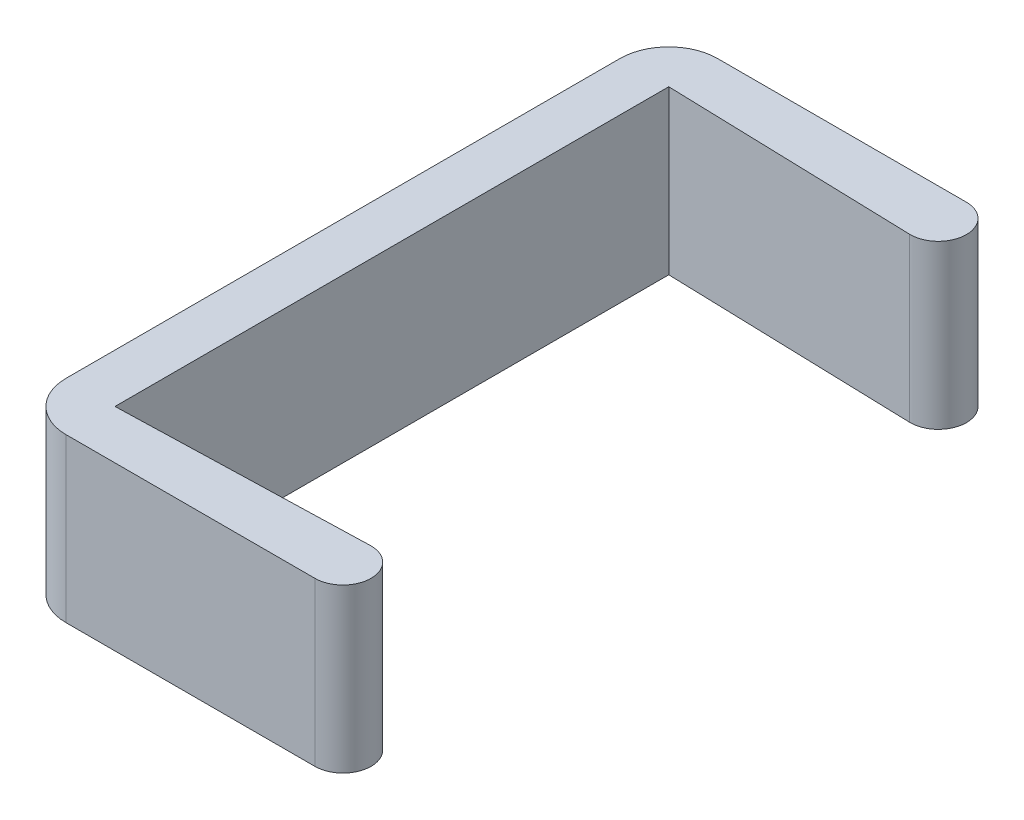
ISO-10303-21;
HEADER;
FILE_DESCRIPTION(('STEP AP214'),'2;1');
FILE_NAME('part.step','',(''),(''),'','','');
FILE_SCHEMA(('AUTOMOTIVE_DESIGN { 1 0 10303 214 1 1 1 1 }'));
ENDSEC;
DATA;
#1=APPLICATION_CONTEXT('core data for automotive mechanical design processes');
#2=APPLICATION_PROTOCOL_DEFINITION('international standard','automotive_design',2000,#1);
#3=PRODUCT_CONTEXT('',#1,'mechanical');
#4=PRODUCT('Part','Part','',(#3));
#5=PRODUCT_RELATED_PRODUCT_CATEGORY('part','',(#4));
#6=PRODUCT_DEFINITION_FORMATION('','',#4);
#7=PRODUCT_DEFINITION_CONTEXT('part definition',#1,'design');
#8=PRODUCT_DEFINITION('design','',#6,#7);
#9=PRODUCT_DEFINITION_SHAPE('','',#8);
#10=(LENGTH_UNIT() NAMED_UNIT(*) SI_UNIT(.MILLI.,.METRE.));
#11=(NAMED_UNIT(*) PLANE_ANGLE_UNIT() SI_UNIT($,.RADIAN.));
#12=(NAMED_UNIT(*) SI_UNIT($,.STERADIAN.) SOLID_ANGLE_UNIT());
#13=UNCERTAINTY_MEASURE_WITH_UNIT(LENGTH_MEASURE(1.E-05),#10,'distance_accuracy_value','');
#14=(GEOMETRIC_REPRESENTATION_CONTEXT(3) GLOBAL_UNCERTAINTY_ASSIGNED_CONTEXT((#13)) GLOBAL_UNIT_ASSIGNED_CONTEXT((#10,
#11,#12)) REPRESENTATION_CONTEXT('',''));
#15=CARTESIAN_POINT('',(0.,0.,0.));
#16=DIRECTION('',(0.,0.,1.));
#17=DIRECTION('',(1.,0.,0.));
#18=AXIS2_PLACEMENT_3D('',#15,#16,#17);
#19=CARTESIAN_POINT('',(-1.72427026906768,10.,-18.2757297309323));
#20=DIRECTION('',(0.,-1.,0.));
#21=DIRECTION('',(0.,0.,-1.));
#22=AXIS2_PLACEMENT_3D('',#19,#20,#21);
#23=CYLINDRICAL_SURFACE('',#22,1.72427026906768);
#24=DIRECTION('',(0.,-1.,0.));
#25=VECTOR('',#24,1.);
#26=CARTESIAN_POINT('',(-1.72427026906768,10.,-20.));
#27=LINE('',#26,#25);
#28=CARTESIAN_POINT('',(-1.72427026906768,10.,-20.));
#29=VERTEX_POINT('',#28);
#30=CARTESIAN_POINT('',(-1.72427026906768,0.,-20.));
#31=VERTEX_POINT('',#30);
#32=EDGE_CURVE('E227',#29,#31,#27,.T.);
#33=ORIENTED_EDGE('',*,*,#32,.F.);
#34=CARTESIAN_POINT('',(-1.72427026906768,10.,-18.2757297309323));
#35=DIRECTION('',(0.,1.,0.));
#36=DIRECTION('',(0.,0.,1.));
#37=AXIS2_PLACEMENT_3D('',#34,#35,#36);
#38=CIRCLE('',#37,1.72427026906768);
#39=CARTESIAN_POINT('',(-1.7749621796836,10.,-16.5522047699907));
#40=VERTEX_POINT('',#39);
#41=EDGE_CURVE('E60',#40,#29,#38,.T.);
#42=ORIENTED_EDGE('',*,*,#41,.F.);
#43=DIRECTION('',(0.,-1.,0.));
#44=VECTOR('',#43,1.);
#45=CARTESIAN_POINT('',(-1.77496217968361,10.,-16.5522047699907));
#46=LINE('',#45,#44);
#47=CARTESIAN_POINT('',(-1.7749621796836,0.,-16.5522047699907));
#48=VERTEX_POINT('',#47);
#49=EDGE_CURVE('E231',#48,#40,#46,.F.);
#50=ORIENTED_EDGE('',*,*,#49,.F.);
#51=CARTESIAN_POINT('',(-1.72427026906768,0.,-18.2757297309323));
#52=DIRECTION('',(0.,1.,0.));
#53=DIRECTION('',(0.,0.,1.));
#54=AXIS2_PLACEMENT_3D('',#51,#52,#53);
#55=CIRCLE('',#54,1.72427026906768);
#56=EDGE_CURVE('E12',#31,#48,#55,.F.);
#57=ORIENTED_EDGE('',*,*,#56,.F.);
#58=EDGE_LOOP('',(#33,#42,#50,#57));
#59=FACE_BOUND('',#58,.T.);
#60=ADVANCED_FACE('F51',(#59),#23,.T.);
#61=CARTESIAN_POINT('',(-1.72427026906767,0.,18.2757297309323));
#62=DIRECTION('',(0.,-1.,0.));
#63=DIRECTION('',(0.,0.,-1.));
#64=AXIS2_PLACEMENT_3D('',#61,#62,#63);
#65=CYLINDRICAL_SURFACE('',#64,1.72427026906768);
#66=DIRECTION('',(0.,-1.,0.));
#67=VECTOR('',#66,1.);
#68=CARTESIAN_POINT('',(-1.72427026906767,10.,20.));
#69=LINE('',#68,#67);
#70=CARTESIAN_POINT('',(-1.72427026906767,0.,20.));
#71=VERTEX_POINT('',#70);
#72=CARTESIAN_POINT('',(-1.72427026906767,10.,20.));
#73=VERTEX_POINT('',#72);
#74=EDGE_CURVE('E215',#71,#73,#69,.F.);
#75=ORIENTED_EDGE('',*,*,#74,.F.);
#76=CARTESIAN_POINT('',(-1.72427026906767,0.,18.2757297309323));
#77=DIRECTION('',(0.,1.,0.));
#78=DIRECTION('',(0.,0.,1.));
#79=AXIS2_PLACEMENT_3D('',#76,#77,#78);
#80=CIRCLE('',#79,1.72427026906768);
#81=CARTESIAN_POINT('',(-1.7749621796836,0.,16.5522047699907));
#82=VERTEX_POINT('',#81);
#83=EDGE_CURVE('E222',#82,#71,#80,.F.);
#84=ORIENTED_EDGE('',*,*,#83,.F.);
#85=DIRECTION('',(0.,-1.,0.));
#86=VECTOR('',#85,1.);
#87=CARTESIAN_POINT('',(-1.77496217968361,10.,16.5522047699907));
#88=LINE('',#87,#86);
#89=CARTESIAN_POINT('',(-1.7749621796836,10.,16.5522047699907));
#90=VERTEX_POINT('',#89);
#91=EDGE_CURVE('E219',#90,#82,#88,.T.);
#92=ORIENTED_EDGE('',*,*,#91,.F.);
#93=CARTESIAN_POINT('',(-1.72427026906767,10.,18.2757297309323));
#94=DIRECTION('',(0.,1.,0.));
#95=DIRECTION('',(0.,0.,1.));
#96=AXIS2_PLACEMENT_3D('',#93,#94,#95);
#97=CIRCLE('',#96,1.72427026906768);
#98=EDGE_CURVE('E134',#73,#90,#97,.T.);
#99=ORIENTED_EDGE('',*,*,#98,.F.);
#100=EDGE_LOOP('',(#75,#84,#92,#99));
#101=FACE_BOUND('',#100,.T.);
#102=ADVANCED_FACE('F262',(#101),#65,.T.);
#103=CARTESIAN_POINT('',(-20.,10.,-20.));
#104=DIRECTION('',(1.,0.,0.));
#105=DIRECTION('',(0.,0.,-1.));
#106=AXIS2_PLACEMENT_3D('',#103,#104,#105);
#107=PLANE('',#106);
#108=DIRECTION('',(0.,0.,1.));
#109=VECTOR('',#108,1.);
#110=CARTESIAN_POINT('',(-20.,10.,-20.));
#111=LINE('',#110,#109);
#112=CARTESIAN_POINT('',(-20.,10.,-17.));
#113=VERTEX_POINT('',#112);
#114=CARTESIAN_POINT('',(-20.,10.,17.));
#115=VERTEX_POINT('',#114);
#116=EDGE_CURVE('E185',#113,#115,#111,.T.);
#117=ORIENTED_EDGE('',*,*,#116,.F.);
#118=DIRECTION('',(0.,-1.,0.));
#119=VECTOR('',#118,1.);
#120=CARTESIAN_POINT('',(-20.,10.,-17.));
#121=LINE('',#120,#119);
#122=CARTESIAN_POINT('',(-20.,0.,-17.));
#123=VERTEX_POINT('',#122);
#124=EDGE_CURVE('E190',#113,#123,#121,.T.);
#125=ORIENTED_EDGE('',*,*,#124,.T.);
#126=DIRECTION('',(0.,0.,1.));
#127=VECTOR('',#126,1.);
#128=CARTESIAN_POINT('',(-20.,0.,-20.));
#129=LINE('',#128,#127);
#130=CARTESIAN_POINT('',(-20.,0.,17.));
#131=VERTEX_POINT('',#130);
#132=EDGE_CURVE('E165',#123,#131,#129,.T.);
#133=ORIENTED_EDGE('',*,*,#132,.T.);
#134=DIRECTION('',(0.,-1.,0.));
#135=VECTOR('',#134,1.);
#136=CARTESIAN_POINT('',(-20.,10.,17.));
#137=LINE('',#136,#135);
#138=EDGE_CURVE('E149',#131,#115,#137,.F.);
#139=ORIENTED_EDGE('',*,*,#138,.T.);
#140=EDGE_LOOP('',(#117,#125,#133,#139));
#141=FACE_BOUND('',#140,.T.);
#142=ADVANCED_FACE('F246',(#141),#107,.F.);
#143=CARTESIAN_POINT('',(-20.,10.,20.));
#144=DIRECTION('',(0.,0.,-1.));
#145=DIRECTION('',(-1.,0.,0.));
#146=AXIS2_PLACEMENT_3D('',#143,#144,#145);
#147=PLANE('',#146);
#148=DIRECTION('',(1.,0.,0.));
#149=VECTOR('',#148,1.);
#150=CARTESIAN_POINT('',(-20.,0.,20.));
#151=LINE('',#150,#149);
#152=CARTESIAN_POINT('',(-17.,0.,20.));
#153=VERTEX_POINT('',#152);
#154=EDGE_CURVE('E169',#153,#71,#151,.T.);
#155=ORIENTED_EDGE('',*,*,#154,.T.);
#156=ORIENTED_EDGE('',*,*,#74,.T.);
#157=DIRECTION('',(1.,0.,0.));
#158=VECTOR('',#157,1.);
#159=CARTESIAN_POINT('',(-20.,10.,20.));
#160=LINE('',#159,#158);
#161=CARTESIAN_POINT('',(-17.,10.,20.));
#162=VERTEX_POINT('',#161);
#163=EDGE_CURVE('E139',#162,#73,#160,.T.);
#164=ORIENTED_EDGE('',*,*,#163,.F.);
#165=DIRECTION('',(0.,-1.,0.));
#166=VECTOR('',#165,1.);
#167=CARTESIAN_POINT('',(-17.,10.,20.));
#168=LINE('',#167,#166);
#169=EDGE_CURVE('E211',#162,#153,#168,.T.);
#170=ORIENTED_EDGE('',*,*,#169,.T.);
#171=EDGE_LOOP('',(#155,#156,#164,#170));
#172=FACE_BOUND('',#171,.T.);
#173=ADVANCED_FACE('F255',(#172),#147,.F.);
#174=CARTESIAN_POINT('',(-17.,10.,17.));
#175=DIRECTION('',(0.0293990516018928,0.,0.999567754464353));
#176=DIRECTION('',(0.999567754464353,0.,-0.0293990516018928));
#177=AXIS2_PLACEMENT_3D('',#174,#175,#176);
#178=PLANE('',#177);
#179=DIRECTION('',(-0.999567754464353,0.,0.0293990516018928));
#180=VECTOR('',#179,1.);
#181=CARTESIAN_POINT('',(-17.,10.,17.));
#182=LINE('',#181,#180);
#183=CARTESIAN_POINT('',(-17.,10.,17.));
#184=VERTEX_POINT('',#183);
#185=EDGE_CURVE('E126',#90,#184,#182,.T.);
#186=ORIENTED_EDGE('',*,*,#185,.F.);
#187=ORIENTED_EDGE('',*,*,#91,.T.);
#188=DIRECTION('',(-0.999567754464353,0.,0.0293990516018928));
#189=VECTOR('',#188,1.);
#190=CARTESIAN_POINT('',(-17.,0.,17.));
#191=LINE('',#190,#189);
#192=CARTESIAN_POINT('',(-17.,0.,17.));
#193=VERTEX_POINT('',#192);
#194=EDGE_CURVE('E145',#82,#193,#191,.T.);
#195=ORIENTED_EDGE('',*,*,#194,.T.);
#196=DIRECTION('',(0.,-1.,0.));
#197=VECTOR('',#196,1.);
#198=CARTESIAN_POINT('',(-17.,10.,17.));
#199=LINE('',#198,#197);
#200=EDGE_CURVE('E142',#184,#193,#199,.T.);
#201=ORIENTED_EDGE('',*,*,#200,.F.);
#202=EDGE_LOOP('',(#186,#187,#195,#201));
#203=FACE_BOUND('',#202,.T.);
#204=ADVANCED_FACE('F143',(#203),#178,.F.);
#205=CARTESIAN_POINT('',(-17.,10.,-17.));
#206=DIRECTION('',(-1.,0.,0.));
#207=DIRECTION('',(0.,0.,1.));
#208=AXIS2_PLACEMENT_3D('',#205,#206,#207);
#209=PLANE('',#208);
#210=DIRECTION('',(0.,0.,-1.));
#211=VECTOR('',#210,1.);
#212=CARTESIAN_POINT('',(-17.,0.,-17.));
#213=LINE('',#212,#211);
#214=CARTESIAN_POINT('',(-17.,0.,-17.));
#215=VERTEX_POINT('',#214);
#216=EDGE_CURVE('E175',#193,#215,#213,.T.);
#217=ORIENTED_EDGE('',*,*,#216,.T.);
#218=DIRECTION('',(0.,-1.,0.));
#219=VECTOR('',#218,1.);
#220=CARTESIAN_POINT('',(-17.,10.,-17.));
#221=LINE('',#220,#219);
#222=CARTESIAN_POINT('',(-17.,10.,-17.));
#223=VERTEX_POINT('',#222);
#224=EDGE_CURVE('E150',#223,#215,#221,.T.);
#225=ORIENTED_EDGE('',*,*,#224,.F.);
#226=DIRECTION('',(0.,0.,-1.));
#227=VECTOR('',#226,1.);
#228=CARTESIAN_POINT('',(-17.,10.,-17.));
#229=LINE('',#228,#227);
#230=EDGE_CURVE('E131',#184,#223,#229,.T.);
#231=ORIENTED_EDGE('',*,*,#230,.F.);
#232=ORIENTED_EDGE('',*,*,#200,.T.);
#233=EDGE_LOOP('',(#217,#225,#231,#232));
#234=FACE_BOUND('',#233,.T.);
#235=ADVANCED_FACE('F152',(#234),#209,.F.);
#236=CARTESIAN_POINT('',(-17.,10.,-17.));
#237=DIRECTION('',(0.0293990516018928,0.,-0.999567754464353));
#238=DIRECTION('',(-0.999567754464353,0.,-0.0293990516018928));
#239=AXIS2_PLACEMENT_3D('',#236,#237,#238);
#240=PLANE('',#239);
#241=DIRECTION('',(0.999567754464353,0.,0.0293990516018928));
#242=VECTOR('',#241,1.);
#243=CARTESIAN_POINT('',(-17.,0.,-17.));
#244=LINE('',#243,#242);
#245=EDGE_CURVE('E178',#215,#48,#244,.T.);
#246=ORIENTED_EDGE('',*,*,#245,.T.);
#247=ORIENTED_EDGE('',*,*,#49,.T.);
#248=DIRECTION('',(0.999567754464353,0.,0.0293990516018928));
#249=VECTOR('',#248,1.);
#250=CARTESIAN_POINT('',(-17.,10.,-17.));
#251=LINE('',#250,#249);
#252=EDGE_CURVE('E156',#223,#40,#251,.T.);
#253=ORIENTED_EDGE('',*,*,#252,.F.);
#254=ORIENTED_EDGE('',*,*,#224,.T.);
#255=EDGE_LOOP('',(#246,#247,#253,#254));
#256=FACE_BOUND('',#255,.T.);
#257=ADVANCED_FACE('F283',(#256),#240,.F.);
#258=CARTESIAN_POINT('',(-20.,10.,-20.));
#259=DIRECTION('',(0.,0.,1.));
#260=DIRECTION('',(1.,0.,0.));
#261=AXIS2_PLACEMENT_3D('',#258,#259,#260);
#262=PLANE('',#261);
#263=DIRECTION('',(-1.,0.,0.));
#264=VECTOR('',#263,1.);
#265=CARTESIAN_POINT('',(-20.,10.,-20.));
#266=LINE('',#265,#264);
#267=CARTESIAN_POINT('',(-17.,10.,-20.));
#268=VERTEX_POINT('',#267);
#269=EDGE_CURVE('E159',#29,#268,#266,.T.);
#270=ORIENTED_EDGE('',*,*,#269,.F.);
#271=ORIENTED_EDGE('',*,*,#32,.T.);
#272=DIRECTION('',(-1.,0.,0.));
#273=VECTOR('',#272,1.);
#274=CARTESIAN_POINT('',(-20.,0.,-20.));
#275=LINE('',#274,#273);
#276=CARTESIAN_POINT('',(-17.,0.,-20.));
#277=VERTEX_POINT('',#276);
#278=EDGE_CURVE('E182',#31,#277,#275,.T.);
#279=ORIENTED_EDGE('',*,*,#278,.T.);
#280=DIRECTION('',(0.,-1.,0.));
#281=VECTOR('',#280,1.);
#282=CARTESIAN_POINT('',(-17.,10.,-20.));
#283=LINE('',#282,#281);
#284=EDGE_CURVE('E201',#277,#268,#283,.F.);
#285=ORIENTED_EDGE('',*,*,#284,.T.);
#286=EDGE_LOOP('',(#270,#271,#279,#285));
#287=FACE_BOUND('',#286,.T.);
#288=ADVANCED_FACE('F236',(#287),#262,.F.);
#289=CARTESIAN_POINT('',(0.,10.,0.));
#290=DIRECTION('',(0.,1.,0.));
#291=DIRECTION('',(0.,0.,1.));
#292=AXIS2_PLACEMENT_3D('',#289,#290,#291);
#293=PLANE('',#292);
#294=ORIENTED_EDGE('',*,*,#252,.T.);
#295=ORIENTED_EDGE('',*,*,#41,.T.);
#296=ORIENTED_EDGE('',*,*,#269,.T.);
#297=CARTESIAN_POINT('',(-17.,10.,-17.));
#298=DIRECTION('',(0.,1.,0.));
#299=DIRECTION('',(0.,0.,1.));
#300=AXIS2_PLACEMENT_3D('',#297,#298,#299);
#301=CIRCLE('',#300,3.);
#302=EDGE_CURVE('E208',#268,#113,#301,.T.);
#303=ORIENTED_EDGE('',*,*,#302,.T.);
#304=ORIENTED_EDGE('',*,*,#116,.T.);
#305=CARTESIAN_POINT('',(-17.,10.,17.));
#306=DIRECTION('',(0.,1.,0.));
#307=DIRECTION('',(0.,0.,1.));
#308=AXIS2_PLACEMENT_3D('',#305,#306,#307);
#309=CIRCLE('',#308,3.);
#310=EDGE_CURVE('E205',#115,#162,#309,.T.);
#311=ORIENTED_EDGE('',*,*,#310,.T.);
#312=ORIENTED_EDGE('',*,*,#163,.T.);
#313=ORIENTED_EDGE('',*,*,#98,.T.);
#314=ORIENTED_EDGE('',*,*,#185,.T.);
#315=ORIENTED_EDGE('',*,*,#230,.T.);
#316=EDGE_LOOP('',(#294,#295,#296,#303,#304,#311,#312,#313,#314,#315));
#317=FACE_BOUND('',#316,.T.);
#318=ADVANCED_FACE('F129',(#317),#293,.T.);
#319=CARTESIAN_POINT('',(0.,0.,0.));
#320=DIRECTION('',(0.,1.,0.));
#321=DIRECTION('',(0.,0.,1.));
#322=AXIS2_PLACEMENT_3D('',#319,#320,#321);
#323=PLANE('',#322);
#324=ORIENTED_EDGE('',*,*,#278,.F.);
#325=ORIENTED_EDGE('',*,*,#56,.T.);
#326=ORIENTED_EDGE('',*,*,#245,.F.);
#327=ORIENTED_EDGE('',*,*,#216,.F.);
#328=ORIENTED_EDGE('',*,*,#194,.F.);
#329=ORIENTED_EDGE('',*,*,#83,.T.);
#330=ORIENTED_EDGE('',*,*,#154,.F.);
#331=CARTESIAN_POINT('',(-17.,0.,17.));
#332=DIRECTION('',(0.,1.,0.));
#333=DIRECTION('',(0.,0.,1.));
#334=AXIS2_PLACEMENT_3D('',#331,#332,#333);
#335=CIRCLE('',#334,3.);
#336=EDGE_CURVE('E194',#153,#131,#335,.F.);
#337=ORIENTED_EDGE('',*,*,#336,.T.);
#338=ORIENTED_EDGE('',*,*,#132,.F.);
#339=CARTESIAN_POINT('',(-17.,0.,-17.));
#340=DIRECTION('',(0.,1.,0.));
#341=DIRECTION('',(0.,0.,1.));
#342=AXIS2_PLACEMENT_3D('',#339,#340,#341);
#343=CIRCLE('',#342,3.);
#344=EDGE_CURVE('E197',#123,#277,#343,.F.);
#345=ORIENTED_EDGE('',*,*,#344,.T.);
#346=EDGE_LOOP('',(#324,#325,#326,#327,#328,#329,#330,#337,#338,#345));
#347=FACE_BOUND('',#346,.T.);
#348=ADVANCED_FACE('F260',(#347),#323,.F.);
#349=CARTESIAN_POINT('',(-17.,10.,-17.));
#350=DIRECTION('',(0.,-1.,0.));
#351=DIRECTION('',(0.,0.,-1.));
#352=AXIS2_PLACEMENT_3D('',#349,#350,#351);
#353=CYLINDRICAL_SURFACE('',#352,3.);
#354=ORIENTED_EDGE('',*,*,#302,.F.);
#355=ORIENTED_EDGE('',*,*,#284,.F.);
#356=ORIENTED_EDGE('',*,*,#344,.F.);
#357=ORIENTED_EDGE('',*,*,#124,.F.);
#358=EDGE_LOOP('',(#354,#355,#356,#357));
#359=FACE_BOUND('',#358,.T.);
#360=ADVANCED_FACE('F241',(#359),#353,.T.);
#361=CARTESIAN_POINT('',(-17.,10.,17.));
#362=DIRECTION('',(0.,-1.,0.));
#363=DIRECTION('',(0.,0.,-1.));
#364=AXIS2_PLACEMENT_3D('',#361,#362,#363);
#365=CYLINDRICAL_SURFACE('',#364,3.);
#366=ORIENTED_EDGE('',*,*,#310,.F.);
#367=ORIENTED_EDGE('',*,*,#138,.F.);
#368=ORIENTED_EDGE('',*,*,#336,.F.);
#369=ORIENTED_EDGE('',*,*,#169,.F.);
#370=EDGE_LOOP('',(#366,#367,#368,#369));
#371=FACE_BOUND('',#370,.T.);
#372=ADVANCED_FACE('F259',(#371),#365,.T.);
#373=CLOSED_SHELL('',(#60,#102,#142,#173,#204,#235,#257,#288,#318,#348,#360,#372));
#374=MANIFOLD_SOLID_BREP('B2',#373);
#375=ADVANCED_BREP_SHAPE_REPRESENTATION('',(#18,#374),#14);
#376=SHAPE_DEFINITION_REPRESENTATION(#9,#375);
ENDSEC;
END-ISO-10303-21;
